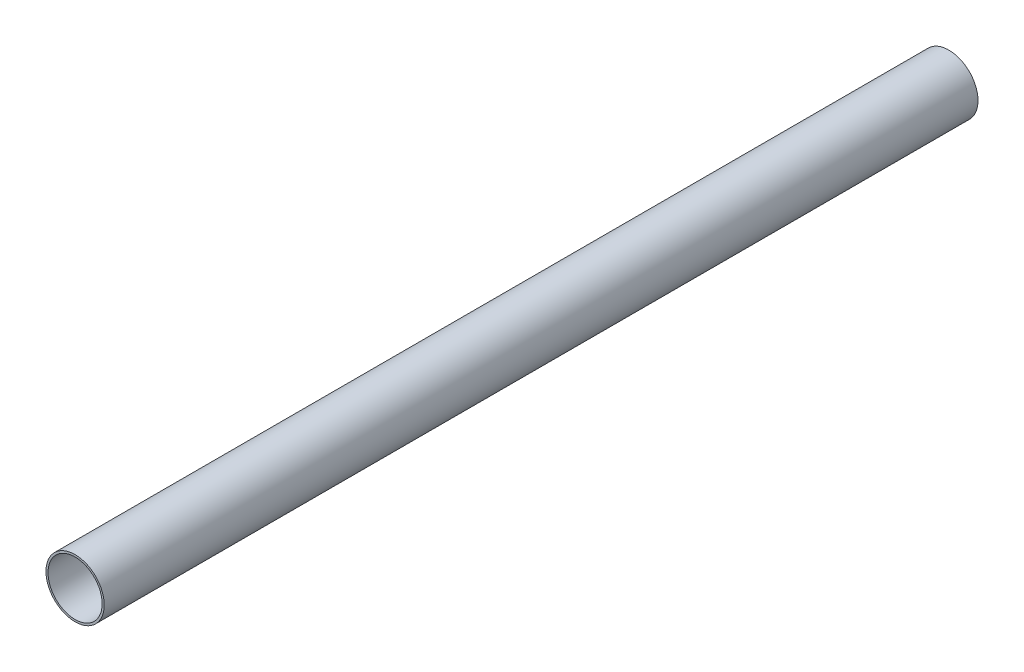
ISO-10303-21;
HEADER;
FILE_DESCRIPTION(('STEP AP214'),'2;1');
FILE_NAME('part.step','',(''),(''),'','','');
FILE_SCHEMA(('AUTOMOTIVE_DESIGN { 1 0 10303 214 1 1 1 1 }'));
ENDSEC;
DATA;
#1=APPLICATION_CONTEXT('core data for automotive mechanical design processes');
#2=APPLICATION_PROTOCOL_DEFINITION('international standard','automotive_design',2000,#1);
#3=PRODUCT_CONTEXT('',#1,'mechanical');
#4=PRODUCT('Part','Part','',(#3));
#5=PRODUCT_RELATED_PRODUCT_CATEGORY('part','',(#4));
#6=PRODUCT_DEFINITION_FORMATION('','',#4);
#7=PRODUCT_DEFINITION_CONTEXT('part definition',#1,'design');
#8=PRODUCT_DEFINITION('design','',#6,#7);
#9=PRODUCT_DEFINITION_SHAPE('','',#8);
#10=(LENGTH_UNIT() NAMED_UNIT(*) SI_UNIT(.MILLI.,.METRE.));
#11=(NAMED_UNIT(*) PLANE_ANGLE_UNIT() SI_UNIT($,.RADIAN.));
#12=(NAMED_UNIT(*) SI_UNIT($,.STERADIAN.) SOLID_ANGLE_UNIT());
#13=UNCERTAINTY_MEASURE_WITH_UNIT(LENGTH_MEASURE(1.E-05),#10,'distance_accuracy_value','');
#14=(GEOMETRIC_REPRESENTATION_CONTEXT(3) GLOBAL_UNCERTAINTY_ASSIGNED_CONTEXT((#13)) GLOBAL_UNIT_ASSIGNED_CONTEXT((#10,
#11,#12)) REPRESENTATION_CONTEXT('',''));
#15=CARTESIAN_POINT('',(0.,0.,0.));
#16=DIRECTION('',(0.,0.,1.));
#17=DIRECTION('',(1.,0.,0.));
#18=AXIS2_PLACEMENT_3D('',#15,#16,#17);
#19=CARTESIAN_POINT('',(0.,0.,381.));
#20=DIRECTION('',(0.,0.,1.));
#21=DIRECTION('',(1.,0.,0.));
#22=AXIS2_PLACEMENT_3D('',#19,#20,#21);
#23=PLANE('',#22);
#24=CARTESIAN_POINT('',(0.,0.,381.));
#25=DIRECTION('',(0.,0.,1.));
#26=DIRECTION('',(1.,0.,0.));
#27=AXIS2_PLACEMENT_3D('',#24,#25,#26);
#28=CIRCLE('',#27,12.7);
#29=CARTESIAN_POINT('',(12.7,0.,381.));
#30=VERTEX_POINT('',#29);
#31=EDGE_CURVE('E10',#30,#30,#28,.T.);
#32=ORIENTED_EDGE('',*,*,#31,.T.);
#33=EDGE_LOOP('',(#32));
#34=FACE_BOUND('',#33,.T.);
#35=CARTESIAN_POINT('',(0.,0.,381.));
#36=DIRECTION('',(0.,0.,1.));
#37=DIRECTION('',(1.,0.,0.));
#38=AXIS2_PLACEMENT_3D('',#35,#36,#37);
#39=CIRCLE('',#38,11.811);
#40=CARTESIAN_POINT('',(11.811,0.,381.));
#41=VERTEX_POINT('',#40);
#42=EDGE_CURVE('E56',#41,#41,#39,.T.);
#43=ORIENTED_EDGE('',*,*,#42,.F.);
#44=EDGE_LOOP('',(#43));
#45=FACE_BOUND('',#44,.T.);
#46=ADVANCED_FACE('F43',(#34,#45),#23,.T.);
#47=CARTESIAN_POINT('',(0.,0.,0.));
#48=DIRECTION('',(0.,0.,1.));
#49=DIRECTION('',(1.,0.,0.));
#50=AXIS2_PLACEMENT_3D('',#47,#48,#49);
#51=PLANE('',#50);
#52=CARTESIAN_POINT('',(0.,0.,0.));
#53=DIRECTION('',(0.,0.,1.));
#54=DIRECTION('',(1.,0.,0.));
#55=AXIS2_PLACEMENT_3D('',#52,#53,#54);
#56=CIRCLE('',#55,12.7);
#57=CARTESIAN_POINT('',(12.7,0.,0.));
#58=VERTEX_POINT('',#57);
#59=EDGE_CURVE('E47',#58,#58,#56,.T.);
#60=ORIENTED_EDGE('',*,*,#59,.F.);
#61=EDGE_LOOP('',(#60));
#62=FACE_BOUND('',#61,.T.);
#63=CARTESIAN_POINT('',(0.,0.,0.));
#64=DIRECTION('',(0.,0.,1.));
#65=DIRECTION('',(1.,0.,0.));
#66=AXIS2_PLACEMENT_3D('',#63,#64,#65);
#67=CIRCLE('',#66,11.811);
#68=CARTESIAN_POINT('',(11.811,0.,0.));
#69=VERTEX_POINT('',#68);
#70=EDGE_CURVE('E58',#69,#69,#67,.T.);
#71=ORIENTED_EDGE('',*,*,#70,.T.);
#72=EDGE_LOOP('',(#71));
#73=FACE_BOUND('',#72,.T.);
#74=ADVANCED_FACE('F70',(#62,#73),#51,.F.);
#75=CARTESIAN_POINT('',(0.,0.,381.));
#76=DIRECTION('',(0.,0.,-1.));
#77=DIRECTION('',(-1.,0.,0.));
#78=AXIS2_PLACEMENT_3D('',#75,#76,#77);
#79=CYLINDRICAL_SURFACE('',#78,12.7);
#80=ORIENTED_EDGE('',*,*,#31,.F.);
#81=EDGE_LOOP('',(#80));
#82=FACE_BOUND('',#81,.T.);
#83=ORIENTED_EDGE('',*,*,#59,.T.);
#84=EDGE_LOOP('',(#83));
#85=FACE_BOUND('',#84,.T.);
#86=ADVANCED_FACE('F45',(#82,#85),#79,.T.);
#87=CARTESIAN_POINT('',(0.,0.,381.));
#88=DIRECTION('',(0.,0.,-1.));
#89=DIRECTION('',(-1.,0.,0.));
#90=AXIS2_PLACEMENT_3D('',#87,#88,#89);
#91=CYLINDRICAL_SURFACE('',#90,11.811);
#92=ORIENTED_EDGE('',*,*,#42,.T.);
#93=EDGE_LOOP('',(#92));
#94=FACE_BOUND('',#93,.T.);
#95=ORIENTED_EDGE('',*,*,#70,.F.);
#96=EDGE_LOOP('',(#95));
#97=FACE_BOUND('',#96,.T.);
#98=ADVANCED_FACE('F66',(#94,#97),#91,.F.);
#99=CLOSED_SHELL('',(#46,#74,#86,#98));
#100=MANIFOLD_SOLID_BREP('B2',#99);
#101=ADVANCED_BREP_SHAPE_REPRESENTATION('',(#18,#100),#14);
#102=SHAPE_DEFINITION_REPRESENTATION(#9,#101);
ENDSEC;
END-ISO-10303-21;
